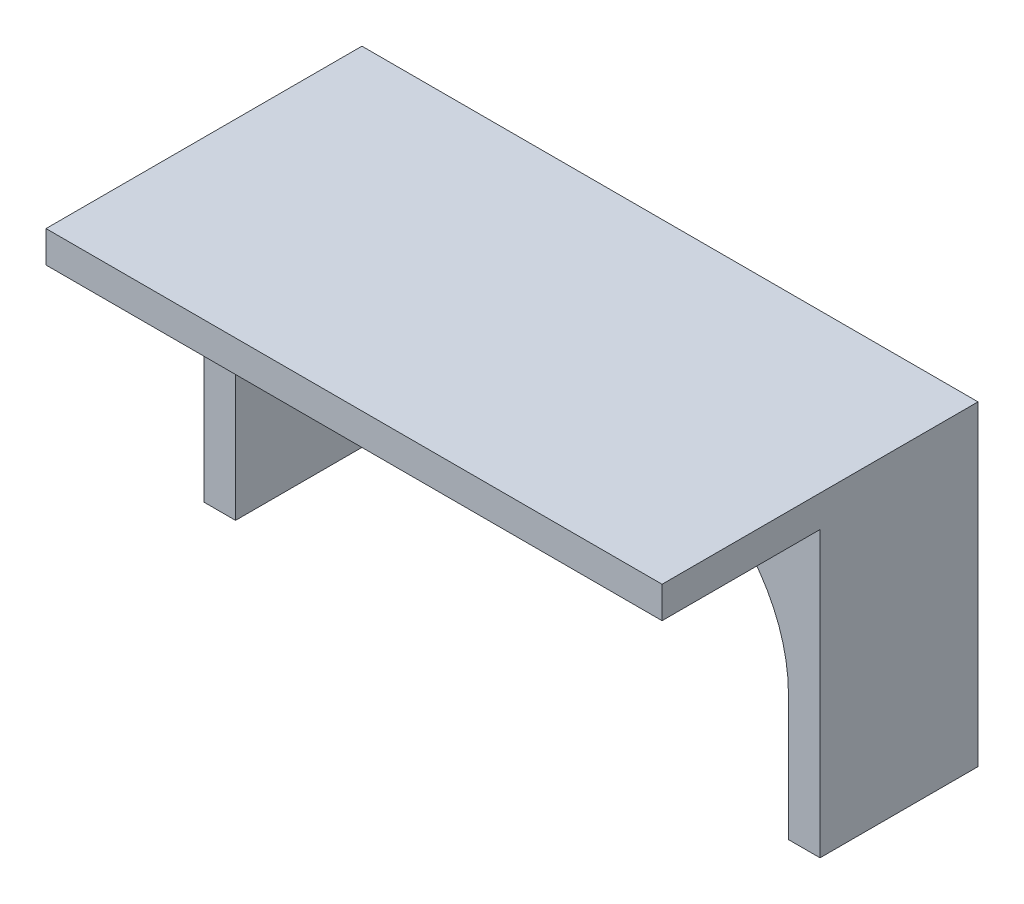
ISO-10303-21;
HEADER;
FILE_DESCRIPTION(('STEP AP214'),'2;1');
FILE_NAME('part.step','',(''),(''),'','','');
FILE_SCHEMA(('AUTOMOTIVE_DESIGN { 1 0 10303 214 1 1 1 1 }'));
ENDSEC;
DATA;
#1=APPLICATION_CONTEXT('core data for automotive mechanical design processes');
#2=APPLICATION_PROTOCOL_DEFINITION('international standard','automotive_design',2000,#1);
#3=PRODUCT_CONTEXT('',#1,'mechanical');
#4=PRODUCT('Part','Part','',(#3));
#5=PRODUCT_RELATED_PRODUCT_CATEGORY('part','',(#4));
#6=PRODUCT_DEFINITION_FORMATION('','',#4);
#7=PRODUCT_DEFINITION_CONTEXT('part definition',#1,'design');
#8=PRODUCT_DEFINITION('design','',#6,#7);
#9=PRODUCT_DEFINITION_SHAPE('','',#8);
#10=(LENGTH_UNIT() NAMED_UNIT(*) SI_UNIT(.MILLI.,.METRE.));
#11=(NAMED_UNIT(*) PLANE_ANGLE_UNIT() SI_UNIT($,.RADIAN.));
#12=(NAMED_UNIT(*) SI_UNIT($,.STERADIAN.) SOLID_ANGLE_UNIT());
#13=UNCERTAINTY_MEASURE_WITH_UNIT(LENGTH_MEASURE(1.E-05),#10,'distance_accuracy_value','');
#14=(GEOMETRIC_REPRESENTATION_CONTEXT(3) GLOBAL_UNCERTAINTY_ASSIGNED_CONTEXT((#13)) GLOBAL_UNIT_ASSIGNED_CONTEXT((#10,
#11,#12)) REPRESENTATION_CONTEXT('',''));
#15=CARTESIAN_POINT('',(0.,0.,0.));
#16=DIRECTION('',(0.,0.,1.));
#17=DIRECTION('',(1.,0.,0.));
#18=AXIS2_PLACEMENT_3D('',#15,#16,#17);
#19=CARTESIAN_POINT('',(0.,0.,10.));
#20=DIRECTION('',(0.,0.,1.));
#21=DIRECTION('',(1.,0.,0.));
#22=AXIS2_PLACEMENT_3D('',#19,#20,#21);
#23=PLANE('',#22);
#24=DIRECTION('',(1.,0.,0.));
#25=VECTOR('',#24,1.);
#26=CARTESIAN_POINT('',(-19.5,18.,10.));
#27=LINE('',#26,#25);
#28=CARTESIAN_POINT('',(-19.5,18.,10.));
#29=VERTEX_POINT('',#28);
#30=CARTESIAN_POINT('',(-7.49999999999998,18.,10.));
#31=VERTEX_POINT('',#30);
#32=EDGE_CURVE('E52',#29,#31,#27,.T.);
#33=ORIENTED_EDGE('',*,*,#32,.F.);
#34=DIRECTION('',(0.,-1.,0.));
#35=VECTOR('',#34,1.);
#36=CARTESIAN_POINT('',(-19.5,0.,10.));
#37=LINE('',#36,#35);
#38=CARTESIAN_POINT('',(-19.5,0.,10.));
#39=VERTEX_POINT('',#38);
#40=EDGE_CURVE('E123',#29,#39,#37,.T.);
#41=ORIENTED_EDGE('',*,*,#40,.T.);
#42=DIRECTION('',(1.,0.,0.));
#43=VECTOR('',#42,1.);
#44=CARTESIAN_POINT('',(0.,0.,10.));
#45=LINE('',#44,#43);
#46=CARTESIAN_POINT('',(-17.5,0.,10.));
#47=VERTEX_POINT('',#46);
#48=EDGE_CURVE('E127',#39,#47,#45,.T.);
#49=ORIENTED_EDGE('',*,*,#48,.T.);
#50=DIRECTION('',(0.,-1.,0.));
#51=VECTOR('',#50,1.);
#52=CARTESIAN_POINT('',(-17.5,0.,10.));
#53=LINE('',#52,#51);
#54=CARTESIAN_POINT('',(-17.5,8.00000000000002,10.));
#55=VERTEX_POINT('',#54);
#56=EDGE_CURVE('E149',#55,#47,#53,.T.);
#57=ORIENTED_EDGE('',*,*,#56,.F.);
#58=CARTESIAN_POINT('',(-7.49999999999998,8.00000000000002,10.));
#59=DIRECTION('',(0.,0.,1.));
#60=DIRECTION('',(1.,0.,0.));
#61=AXIS2_PLACEMENT_3D('',#58,#59,#60);
#62=CIRCLE('',#61,10.);
#63=EDGE_CURVE('E169',#31,#55,#62,.T.);
#64=ORIENTED_EDGE('',*,*,#63,.F.);
#65=EDGE_LOOP('',(#33,#41,#49,#57,#64));
#66=FACE_BOUND('',#65,.T.);
#67=ADVANCED_FACE('F41',(#66),#23,.T.);
#68=CARTESIAN_POINT('',(-7.49999999999998,8.00000000000002,10.));
#69=DIRECTION('',(0.,0.,-1.));
#70=DIRECTION('',(-1.,0.,0.));
#71=AXIS2_PLACEMENT_3D('',#68,#69,#70);
#72=CYLINDRICAL_SURFACE('',#71,10.);
#73=CARTESIAN_POINT('',(-7.49999999999998,8.00000000000002,0.));
#74=DIRECTION('',(0.,0.,1.));
#75=DIRECTION('',(1.,0.,0.));
#76=AXIS2_PLACEMENT_3D('',#73,#74,#75);
#77=CIRCLE('',#76,10.);
#78=CARTESIAN_POINT('',(-7.49999999999998,18.,0.));
#79=VERTEX_POINT('',#78);
#80=CARTESIAN_POINT('',(-17.5,8.00000000000002,0.));
#81=VERTEX_POINT('',#80);
#82=EDGE_CURVE('E178',#79,#81,#77,.T.);
#83=ORIENTED_EDGE('',*,*,#82,.F.);
#84=DIRECTION('',(0.,0.,-1.));
#85=VECTOR('',#84,1.);
#86=CARTESIAN_POINT('',(-7.49999999999998,18.,10.));
#87=LINE('',#86,#85);
#88=EDGE_CURVE('E45',#31,#79,#87,.T.);
#89=ORIENTED_EDGE('',*,*,#88,.F.);
#90=ORIENTED_EDGE('',*,*,#63,.T.);
#91=DIRECTION('',(0.,0.,-1.));
#92=VECTOR('',#91,1.);
#93=CARTESIAN_POINT('',(-17.5,8.00000000000002,10.));
#94=LINE('',#93,#92);
#95=EDGE_CURVE('E67',#55,#81,#94,.T.);
#96=ORIENTED_EDGE('',*,*,#95,.T.);
#97=EDGE_LOOP('',(#83,#89,#90,#96));
#98=FACE_BOUND('',#97,.T.);
#99=ADVANCED_FACE('F43',(#98),#72,.F.);
#100=CARTESIAN_POINT('',(0.,18.,10.));
#101=DIRECTION('',(0.,1.,0.));
#102=DIRECTION('',(0.,0.,1.));
#103=AXIS2_PLACEMENT_3D('',#100,#101,#102);
#104=PLANE('',#103);
#105=DIRECTION('',(1.,0.,0.));
#106=VECTOR('',#105,1.);
#107=CARTESIAN_POINT('',(0.,18.,0.));
#108=LINE('',#107,#106);
#109=CARTESIAN_POINT('',(7.50000000000002,18.,0.));
#110=VERTEX_POINT('',#109);
#111=EDGE_CURVE('E250',#79,#110,#108,.T.);
#112=ORIENTED_EDGE('',*,*,#111,.T.);
#113=DIRECTION('',(0.,0.,-1.));
#114=VECTOR('',#113,1.);
#115=CARTESIAN_POINT('',(7.50000000000002,18.,10.));
#116=LINE('',#115,#114);
#117=CARTESIAN_POINT('',(7.50000000000002,18.,10.));
#118=VERTEX_POINT('',#117);
#119=EDGE_CURVE('E242',#118,#110,#116,.T.);
#120=ORIENTED_EDGE('',*,*,#119,.F.);
#121=CARTESIAN_POINT('',(19.5,18.,10.));
#122=VERTEX_POINT('',#121);
#123=EDGE_CURVE('E11',#118,#122,#27,.T.);
#124=ORIENTED_EDGE('',*,*,#123,.T.);
#125=DIRECTION('',(0.,0.,-1.));
#126=VECTOR('',#125,1.);
#127=CARTESIAN_POINT('',(19.5,18.,20.));
#128=LINE('',#127,#126);
#129=CARTESIAN_POINT('',(19.5,18.,20.));
#130=VERTEX_POINT('',#129);
#131=EDGE_CURVE('E179',#130,#122,#128,.T.);
#132=ORIENTED_EDGE('',*,*,#131,.F.);
#133=DIRECTION('',(1.,0.,0.));
#134=VECTOR('',#133,1.);
#135=CARTESIAN_POINT('',(-19.5,18.,20.));
#136=LINE('',#135,#134);
#137=CARTESIAN_POINT('',(-19.5,18.,20.));
#138=VERTEX_POINT('',#137);
#139=EDGE_CURVE('E193',#138,#130,#136,.T.);
#140=ORIENTED_EDGE('',*,*,#139,.F.);
#141=DIRECTION('',(0.,0.,-1.));
#142=VECTOR('',#141,1.);
#143=CARTESIAN_POINT('',(-19.5,18.,20.));
#144=LINE('',#143,#142);
#145=EDGE_CURVE('E175',#138,#29,#144,.T.);
#146=ORIENTED_EDGE('',*,*,#145,.T.);
#147=ORIENTED_EDGE('',*,*,#32,.T.);
#148=ORIENTED_EDGE('',*,*,#88,.T.);
#149=EDGE_LOOP('',(#112,#120,#124,#132,#140,#146,#147,#148));
#150=FACE_BOUND('',#149,.T.);
#151=ADVANCED_FACE('F209',(#150),#104,.F.);
#152=CARTESIAN_POINT('',(7.50000000000002,8.00000000000002,10.));
#153=DIRECTION('',(0.,0.,-1.));
#154=DIRECTION('',(-1.,0.,0.));
#155=AXIS2_PLACEMENT_3D('',#152,#153,#154);
#156=CYLINDRICAL_SURFACE('',#155,10.);
#157=CARTESIAN_POINT('',(7.50000000000002,8.00000000000002,0.));
#158=DIRECTION('',(0.,0.,1.));
#159=DIRECTION('',(1.,0.,0.));
#160=AXIS2_PLACEMENT_3D('',#157,#158,#159);
#161=CIRCLE('',#160,10.);
#162=CARTESIAN_POINT('',(17.5,8.00000000000002,0.));
#163=VERTEX_POINT('',#162);
#164=EDGE_CURVE('E255',#110,#163,#161,.F.);
#165=ORIENTED_EDGE('',*,*,#164,.T.);
#166=DIRECTION('',(0.,0.,-1.));
#167=VECTOR('',#166,1.);
#168=CARTESIAN_POINT('',(17.5,8.00000000000002,10.));
#169=LINE('',#168,#167);
#170=CARTESIAN_POINT('',(17.5,8.00000000000002,10.));
#171=VERTEX_POINT('',#170);
#172=EDGE_CURVE('E239',#171,#163,#169,.T.);
#173=ORIENTED_EDGE('',*,*,#172,.F.);
#174=CARTESIAN_POINT('',(7.50000000000002,8.00000000000002,10.));
#175=DIRECTION('',(0.,0.,1.));
#176=DIRECTION('',(1.,0.,0.));
#177=AXIS2_PLACEMENT_3D('',#174,#175,#176);
#178=CIRCLE('',#177,10.);
#179=EDGE_CURVE('E165',#118,#171,#178,.F.);
#180=ORIENTED_EDGE('',*,*,#179,.F.);
#181=ORIENTED_EDGE('',*,*,#119,.T.);
#182=EDGE_LOOP('',(#165,#173,#180,#181));
#183=FACE_BOUND('',#182,.T.);
#184=ADVANCED_FACE('F291',(#183),#156,.F.);
#185=CARTESIAN_POINT('',(17.5,0.,10.));
#186=DIRECTION('',(1.,0.,0.));
#187=DIRECTION('',(0.,1.,0.));
#188=AXIS2_PLACEMENT_3D('',#185,#186,#187);
#189=PLANE('',#188);
#190=DIRECTION('',(0.,-1.,0.));
#191=VECTOR('',#190,1.);
#192=CARTESIAN_POINT('',(17.5,0.,0.));
#193=LINE('',#192,#191);
#194=CARTESIAN_POINT('',(17.5,0.,0.));
#195=VERTEX_POINT('',#194);
#196=EDGE_CURVE('E263',#163,#195,#193,.T.);
#197=ORIENTED_EDGE('',*,*,#196,.T.);
#198=DIRECTION('',(0.,0.,-1.));
#199=VECTOR('',#198,1.);
#200=CARTESIAN_POINT('',(17.5,0.,10.));
#201=LINE('',#200,#199);
#202=CARTESIAN_POINT('',(17.5,0.,10.));
#203=VERTEX_POINT('',#202);
#204=EDGE_CURVE('E235',#203,#195,#201,.T.);
#205=ORIENTED_EDGE('',*,*,#204,.F.);
#206=DIRECTION('',(0.,-1.,0.));
#207=VECTOR('',#206,1.);
#208=CARTESIAN_POINT('',(17.5,0.,10.));
#209=LINE('',#208,#207);
#210=EDGE_CURVE('E158',#171,#203,#209,.T.);
#211=ORIENTED_EDGE('',*,*,#210,.F.);
#212=ORIENTED_EDGE('',*,*,#172,.T.);
#213=EDGE_LOOP('',(#197,#205,#211,#212));
#214=FACE_BOUND('',#213,.T.);
#215=ADVANCED_FACE('F289',(#214),#189,.F.);
#216=CARTESIAN_POINT('',(0.,0.,10.));
#217=DIRECTION('',(0.,1.,0.));
#218=DIRECTION('',(0.,0.,1.));
#219=AXIS2_PLACEMENT_3D('',#216,#217,#218);
#220=PLANE('',#219);
#221=DIRECTION('',(1.,0.,0.));
#222=VECTOR('',#221,1.);
#223=CARTESIAN_POINT('',(0.,0.,0.));
#224=LINE('',#223,#222);
#225=CARTESIAN_POINT('',(19.5,0.,0.));
#226=VERTEX_POINT('',#225);
#227=EDGE_CURVE('E266',#195,#226,#224,.T.);
#228=ORIENTED_EDGE('',*,*,#227,.T.);
#229=DIRECTION('',(0.,0.,-1.));
#230=VECTOR('',#229,1.);
#231=CARTESIAN_POINT('',(19.5,0.,10.));
#232=LINE('',#231,#230);
#233=CARTESIAN_POINT('',(19.5,0.,10.));
#234=VERTEX_POINT('',#233);
#235=EDGE_CURVE('E229',#234,#226,#232,.T.);
#236=ORIENTED_EDGE('',*,*,#235,.F.);
#237=EDGE_CURVE('E151',#203,#234,#45,.T.);
#238=ORIENTED_EDGE('',*,*,#237,.F.);
#239=ORIENTED_EDGE('',*,*,#204,.T.);
#240=EDGE_LOOP('',(#228,#236,#238,#239));
#241=FACE_BOUND('',#240,.T.);
#242=ADVANCED_FACE('F287',(#241),#220,.F.);
#243=CARTESIAN_POINT('',(19.5,0.,10.));
#244=DIRECTION('',(1.,0.,0.));
#245=DIRECTION('',(0.,1.,0.));
#246=AXIS2_PLACEMENT_3D('',#243,#244,#245);
#247=PLANE('',#246);
#248=DIRECTION('',(0.,-1.,0.));
#249=VECTOR('',#248,1.);
#250=CARTESIAN_POINT('',(19.5,0.,0.));
#251=LINE('',#250,#249);
#252=CARTESIAN_POINT('',(19.5,20.,0.));
#253=VERTEX_POINT('',#252);
#254=EDGE_CURVE('E270',#253,#226,#251,.T.);
#255=ORIENTED_EDGE('',*,*,#254,.F.);
#256=DIRECTION('',(0.,0.,-1.));
#257=VECTOR('',#256,1.);
#258=CARTESIAN_POINT('',(19.5,20.,10.));
#259=LINE('',#258,#257);
#260=CARTESIAN_POINT('',(19.5,20.,20.));
#261=VERTEX_POINT('',#260);
#262=EDGE_CURVE('E218',#261,#253,#259,.T.);
#263=ORIENTED_EDGE('',*,*,#262,.F.);
#264=DIRECTION('',(0.,1.,0.));
#265=VECTOR('',#264,1.);
#266=CARTESIAN_POINT('',(19.5,20.,20.));
#267=LINE('',#266,#265);
#268=EDGE_CURVE('E189',#130,#261,#267,.T.);
#269=ORIENTED_EDGE('',*,*,#268,.F.);
#270=ORIENTED_EDGE('',*,*,#131,.T.);
#271=DIRECTION('',(0.,-1.,0.));
#272=VECTOR('',#271,1.);
#273=CARTESIAN_POINT('',(19.5,0.,10.));
#274=LINE('',#273,#272);
#275=EDGE_CURVE('E133',#122,#234,#274,.T.);
#276=ORIENTED_EDGE('',*,*,#275,.T.);
#277=ORIENTED_EDGE('',*,*,#235,.T.);
#278=EDGE_LOOP('',(#255,#263,#269,#270,#276,#277));
#279=FACE_BOUND('',#278,.T.);
#280=ADVANCED_FACE('F217',(#279),#247,.T.);
#281=CARTESIAN_POINT('',(0.,20.,10.));
#282=DIRECTION('',(0.,1.,0.));
#283=DIRECTION('',(0.,0.,1.));
#284=AXIS2_PLACEMENT_3D('',#281,#282,#283);
#285=PLANE('',#284);
#286=DIRECTION('',(1.,0.,0.));
#287=VECTOR('',#286,1.);
#288=CARTESIAN_POINT('',(0.,20.,0.));
#289=LINE('',#288,#287);
#290=CARTESIAN_POINT('',(-19.5,20.,0.));
#291=VERTEX_POINT('',#290);
#292=EDGE_CURVE('E225',#291,#253,#289,.T.);
#293=ORIENTED_EDGE('',*,*,#292,.F.);
#294=DIRECTION('',(0.,0.,-1.));
#295=VECTOR('',#294,1.);
#296=CARTESIAN_POINT('',(-19.5,20.,10.));
#297=LINE('',#296,#295);
#298=CARTESIAN_POINT('',(-19.5,20.,20.));
#299=VERTEX_POINT('',#298);
#300=EDGE_CURVE('E144',#299,#291,#297,.T.);
#301=ORIENTED_EDGE('',*,*,#300,.F.);
#302=DIRECTION('',(-1.,0.,0.));
#303=VECTOR('',#302,1.);
#304=CARTESIAN_POINT('',(-19.5,20.,20.));
#305=LINE('',#304,#303);
#306=EDGE_CURVE('E182',#261,#299,#305,.T.);
#307=ORIENTED_EDGE('',*,*,#306,.F.);
#308=ORIENTED_EDGE('',*,*,#262,.T.);
#309=EDGE_LOOP('',(#293,#301,#307,#308));
#310=FACE_BOUND('',#309,.T.);
#311=ADVANCED_FACE('F223',(#310),#285,.T.);
#312=CARTESIAN_POINT('',(-19.5,0.,10.));
#313=DIRECTION('',(1.,0.,0.));
#314=DIRECTION('',(0.,0.,-1.));
#315=AXIS2_PLACEMENT_3D('',#312,#313,#314);
#316=PLANE('',#315);
#317=DIRECTION('',(0.,-1.,0.));
#318=VECTOR('',#317,1.);
#319=CARTESIAN_POINT('',(-19.5,0.,0.));
#320=LINE('',#319,#318);
#321=CARTESIAN_POINT('',(-19.5,0.,0.));
#322=VERTEX_POINT('',#321);
#323=EDGE_CURVE('E139',#291,#322,#320,.T.);
#324=ORIENTED_EDGE('',*,*,#323,.T.);
#325=DIRECTION('',(0.,0.,-1.));
#326=VECTOR('',#325,1.);
#327=CARTESIAN_POINT('',(-19.5,0.,10.));
#328=LINE('',#327,#326);
#329=EDGE_CURVE('E136',#39,#322,#328,.T.);
#330=ORIENTED_EDGE('',*,*,#329,.F.);
#331=ORIENTED_EDGE('',*,*,#40,.F.);
#332=ORIENTED_EDGE('',*,*,#145,.F.);
#333=DIRECTION('',(0.,-1.,0.));
#334=VECTOR('',#333,1.);
#335=CARTESIAN_POINT('',(-19.5,20.,20.));
#336=LINE('',#335,#334);
#337=EDGE_CURVE('E185',#299,#138,#336,.T.);
#338=ORIENTED_EDGE('',*,*,#337,.F.);
#339=ORIENTED_EDGE('',*,*,#300,.T.);
#340=EDGE_LOOP('',(#324,#330,#331,#332,#338,#339));
#341=FACE_BOUND('',#340,.T.);
#342=ADVANCED_FACE('F137',(#341),#316,.F.);
#343=CARTESIAN_POINT('',(-17.5,0.,0.));
#344=VERTEX_POINT('',#343);
#345=EDGE_CURVE('E271',#322,#344,#224,.T.);
#346=ORIENTED_EDGE('',*,*,#345,.T.);
#347=DIRECTION('',(0.,0.,-1.));
#348=VECTOR('',#347,1.);
#349=CARTESIAN_POINT('',(-17.5,0.,10.));
#350=LINE('',#349,#348);
#351=EDGE_CURVE('E145',#47,#344,#350,.T.);
#352=ORIENTED_EDGE('',*,*,#351,.F.);
#353=ORIENTED_EDGE('',*,*,#48,.F.);
#354=ORIENTED_EDGE('',*,*,#329,.T.);
#355=EDGE_LOOP('',(#346,#352,#353,#354));
#356=FACE_BOUND('',#355,.T.);
#357=ADVANCED_FACE('F147',(#356),#220,.F.);
#358=CARTESIAN_POINT('',(-17.5,0.,10.));
#359=DIRECTION('',(1.,0.,0.));
#360=DIRECTION('',(0.,1.,0.));
#361=AXIS2_PLACEMENT_3D('',#358,#359,#360);
#362=PLANE('',#361);
#363=DIRECTION('',(0.,-1.,0.));
#364=VECTOR('',#363,1.);
#365=CARTESIAN_POINT('',(-17.5,0.,0.));
#366=LINE('',#365,#364);
#367=EDGE_CURVE('E174',#81,#344,#366,.T.);
#368=ORIENTED_EDGE('',*,*,#367,.F.);
#369=ORIENTED_EDGE('',*,*,#95,.F.);
#370=ORIENTED_EDGE('',*,*,#56,.T.);
#371=ORIENTED_EDGE('',*,*,#351,.T.);
#372=EDGE_LOOP('',(#368,#369,#370,#371));
#373=FACE_BOUND('',#372,.T.);
#374=ADVANCED_FACE('F283',(#373),#362,.T.);
#375=ORIENTED_EDGE('',*,*,#123,.F.);
#376=ORIENTED_EDGE('',*,*,#179,.T.);
#377=ORIENTED_EDGE('',*,*,#210,.T.);
#378=ORIENTED_EDGE('',*,*,#237,.T.);
#379=ORIENTED_EDGE('',*,*,#275,.F.);
#380=EDGE_LOOP('',(#375,#376,#377,#378,#379));
#381=FACE_BOUND('',#380,.T.);
#382=ADVANCED_FACE('F292',(#381),#23,.T.);
#383=CARTESIAN_POINT('',(0.,0.,0.));
#384=DIRECTION('',(0.,0.,1.));
#385=DIRECTION('',(1.,0.,0.));
#386=AXIS2_PLACEMENT_3D('',#383,#384,#385);
#387=PLANE('',#386);
#388=ORIENTED_EDGE('',*,*,#82,.T.);
#389=ORIENTED_EDGE('',*,*,#367,.T.);
#390=ORIENTED_EDGE('',*,*,#345,.F.);
#391=ORIENTED_EDGE('',*,*,#323,.F.);
#392=ORIENTED_EDGE('',*,*,#292,.T.);
#393=ORIENTED_EDGE('',*,*,#254,.T.);
#394=ORIENTED_EDGE('',*,*,#227,.F.);
#395=ORIENTED_EDGE('',*,*,#196,.F.);
#396=ORIENTED_EDGE('',*,*,#164,.F.);
#397=ORIENTED_EDGE('',*,*,#111,.F.);
#398=EDGE_LOOP('',(#388,#389,#390,#391,#392,#393,#394,#395,#396,#397));
#399=FACE_BOUND('',#398,.T.);
#400=ADVANCED_FACE('F252',(#399),#387,.F.);
#401=CARTESIAN_POINT('',(0.,0.,20.));
#402=DIRECTION('',(0.,0.,1.));
#403=DIRECTION('',(1.,0.,0.));
#404=AXIS2_PLACEMENT_3D('',#401,#402,#403);
#405=PLANE('',#404);
#406=ORIENTED_EDGE('',*,*,#337,.T.);
#407=ORIENTED_EDGE('',*,*,#139,.T.);
#408=ORIENTED_EDGE('',*,*,#268,.T.);
#409=ORIENTED_EDGE('',*,*,#306,.T.);
#410=EDGE_LOOP('',(#406,#407,#408,#409));
#411=FACE_BOUND('',#410,.T.);
#412=ADVANCED_FACE('F202',(#411),#405,.T.);
#413=CLOSED_SHELL('',(#67,#99,#151,#184,#215,#242,#280,#311,#342,#357,#374,#382,#400,#412));
#414=MANIFOLD_SOLID_BREP('B2',#413);
#415=ADVANCED_BREP_SHAPE_REPRESENTATION('',(#18,#414),#14);
#416=SHAPE_DEFINITION_REPRESENTATION(#9,#415);
ENDSEC;
END-ISO-10303-21;
